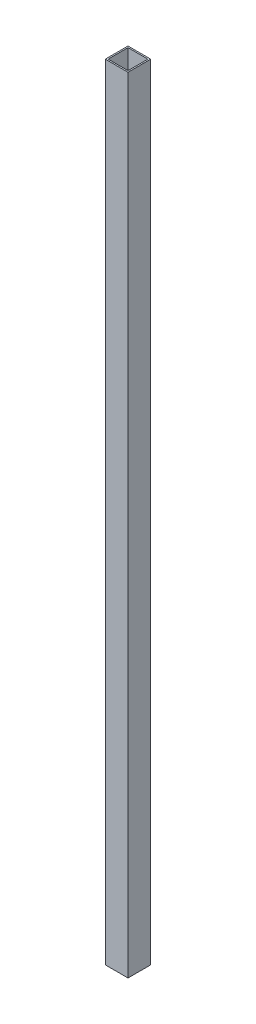
ISO-10303-21;
HEADER;
FILE_DESCRIPTION(('STEP AP214'),'2;1');
FILE_NAME('part.step','',(''),(''),'','','');
FILE_SCHEMA(('AUTOMOTIVE_DESIGN { 1 0 10303 214 1 1 1 1 }'));
ENDSEC;
DATA;
#1=APPLICATION_CONTEXT('core data for automotive mechanical design processes');
#2=APPLICATION_PROTOCOL_DEFINITION('international standard','automotive_design',2000,#1);
#3=PRODUCT_CONTEXT('',#1,'mechanical');
#4=PRODUCT('Part','Part','',(#3));
#5=PRODUCT_RELATED_PRODUCT_CATEGORY('part','',(#4));
#6=PRODUCT_DEFINITION_FORMATION('','',#4);
#7=PRODUCT_DEFINITION_CONTEXT('part definition',#1,'design');
#8=PRODUCT_DEFINITION('design','',#6,#7);
#9=PRODUCT_DEFINITION_SHAPE('','',#8);
#10=(LENGTH_UNIT() NAMED_UNIT(*) SI_UNIT(.MILLI.,.METRE.));
#11=(NAMED_UNIT(*) PLANE_ANGLE_UNIT() SI_UNIT($,.RADIAN.));
#12=(NAMED_UNIT(*) SI_UNIT($,.STERADIAN.) SOLID_ANGLE_UNIT());
#13=UNCERTAINTY_MEASURE_WITH_UNIT(LENGTH_MEASURE(1.E-05),#10,'distance_accuracy_value','');
#14=(GEOMETRIC_REPRESENTATION_CONTEXT(3) GLOBAL_UNCERTAINTY_ASSIGNED_CONTEXT((#13)) GLOBAL_UNIT_ASSIGNED_CONTEXT((#10,
#11,#12)) REPRESENTATION_CONTEXT('',''));
#15=CARTESIAN_POINT('',(0.,0.,0.));
#16=DIRECTION('',(0.,0.,1.));
#17=DIRECTION('',(1.,0.,0.));
#18=AXIS2_PLACEMENT_3D('',#15,#16,#17);
#19=CARTESIAN_POINT('',(0.,876.3,0.));
#20=DIRECTION('',(0.,-1.,0.));
#21=DIRECTION('',(0.,0.,-1.));
#22=AXIS2_PLACEMENT_3D('',#19,#20,#21);
#23=PLANE('',#22);
#24=DIRECTION('',(0.,0.,1.));
#25=VECTOR('',#24,1.);
#26=CARTESIAN_POINT('',(-12.7,876.3,-12.7));
#27=LINE('',#26,#25);
#28=CARTESIAN_POINT('',(-12.7,876.3,-12.7));
#29=VERTEX_POINT('',#28);
#30=CARTESIAN_POINT('',(-12.7,876.3,12.7));
#31=VERTEX_POINT('',#30);
#32=EDGE_CURVE('E133',#29,#31,#27,.T.);
#33=ORIENTED_EDGE('',*,*,#32,.T.);
#34=DIRECTION('',(1.,0.,0.));
#35=VECTOR('',#34,1.);
#36=CARTESIAN_POINT('',(12.7,876.3,12.7));
#37=LINE('',#36,#35);
#38=CARTESIAN_POINT('',(12.7,876.3,12.7));
#39=VERTEX_POINT('',#38);
#40=EDGE_CURVE('E136',#31,#39,#37,.T.);
#41=ORIENTED_EDGE('',*,*,#40,.T.);
#42=DIRECTION('',(0.,0.,-1.));
#43=VECTOR('',#42,1.);
#44=CARTESIAN_POINT('',(12.7,876.3,-12.7));
#45=LINE('',#44,#43);
#46=CARTESIAN_POINT('',(12.7,876.3,-12.7));
#47=VERTEX_POINT('',#46);
#48=EDGE_CURVE('E139',#39,#47,#45,.T.);
#49=ORIENTED_EDGE('',*,*,#48,.T.);
#50=DIRECTION('',(-1.,0.,0.));
#51=VECTOR('',#50,1.);
#52=CARTESIAN_POINT('',(12.7,876.3,-12.7));
#53=LINE('',#52,#51);
#54=EDGE_CURVE('E141',#47,#29,#53,.T.);
#55=ORIENTED_EDGE('',*,*,#54,.T.);
#56=EDGE_LOOP('',(#33,#41,#49,#55));
#57=FACE_BOUND('',#56,.T.);
#58=DIRECTION('',(0.,0.,1.));
#59=VECTOR('',#58,1.);
#60=CARTESIAN_POINT('',(-11.1125,876.3,-11.1125));
#61=LINE('',#60,#59);
#62=CARTESIAN_POINT('',(-11.1125,876.3,-11.1125));
#63=VERTEX_POINT('',#62);
#64=CARTESIAN_POINT('',(-11.1125,876.3,11.1125));
#65=VERTEX_POINT('',#64);
#66=EDGE_CURVE('E97',#63,#65,#61,.T.);
#67=ORIENTED_EDGE('',*,*,#66,.F.);
#68=DIRECTION('',(-1.,0.,0.));
#69=VECTOR('',#68,1.);
#70=CARTESIAN_POINT('',(11.1125,876.3,-11.1125));
#71=LINE('',#70,#69);
#72=CARTESIAN_POINT('',(11.1125,876.3,-11.1125));
#73=VERTEX_POINT('',#72);
#74=EDGE_CURVE('E119',#73,#63,#71,.T.);
#75=ORIENTED_EDGE('',*,*,#74,.F.);
#76=DIRECTION('',(0.,0.,-1.));
#77=VECTOR('',#76,1.);
#78=CARTESIAN_POINT('',(11.1125,876.3,-11.1125));
#79=LINE('',#78,#77);
#80=CARTESIAN_POINT('',(11.1125,876.3,11.1125));
#81=VERTEX_POINT('',#80);
#82=EDGE_CURVE('E117',#81,#73,#79,.T.);
#83=ORIENTED_EDGE('',*,*,#82,.F.);
#84=DIRECTION('',(1.,0.,0.));
#85=VECTOR('',#84,1.);
#86=CARTESIAN_POINT('',(11.1125,876.3,11.1125));
#87=LINE('',#86,#85);
#88=EDGE_CURVE('E105',#65,#81,#87,.T.);
#89=ORIENTED_EDGE('',*,*,#88,.F.);
#90=EDGE_LOOP('',(#67,#75,#83,#89));
#91=FACE_BOUND('',#90,.T.);
#92=ADVANCED_FACE('F32',(#57,#91),#23,.F.);
#93=CARTESIAN_POINT('',(0.,0.,0.));
#94=DIRECTION('',(0.,-1.,0.));
#95=DIRECTION('',(0.,0.,-1.));
#96=AXIS2_PLACEMENT_3D('',#93,#94,#95);
#97=PLANE('',#96);
#98=DIRECTION('',(0.,0.,1.));
#99=VECTOR('',#98,1.);
#100=CARTESIAN_POINT('',(-12.7,0.,-12.7));
#101=LINE('',#100,#99);
#102=CARTESIAN_POINT('',(-12.7,0.,-12.7));
#103=VERTEX_POINT('',#102);
#104=CARTESIAN_POINT('',(-12.7,0.,12.7));
#105=VERTEX_POINT('',#104);
#106=EDGE_CURVE('E113',#103,#105,#101,.T.);
#107=ORIENTED_EDGE('',*,*,#106,.F.);
#108=DIRECTION('',(-1.,0.,0.));
#109=VECTOR('',#108,1.);
#110=CARTESIAN_POINT('',(12.7,0.,-12.7));
#111=LINE('',#110,#109);
#112=CARTESIAN_POINT('',(12.7,0.,-12.7));
#113=VERTEX_POINT('',#112);
#114=EDGE_CURVE('E137',#113,#103,#111,.T.);
#115=ORIENTED_EDGE('',*,*,#114,.F.);
#116=DIRECTION('',(0.,0.,-1.));
#117=VECTOR('',#116,1.);
#118=CARTESIAN_POINT('',(12.7,0.,-12.7));
#119=LINE('',#118,#117);
#120=CARTESIAN_POINT('',(12.7,0.,12.7));
#121=VERTEX_POINT('',#120);
#122=EDGE_CURVE('E148',#121,#113,#119,.T.);
#123=ORIENTED_EDGE('',*,*,#122,.F.);
#124=DIRECTION('',(1.,0.,0.));
#125=VECTOR('',#124,1.);
#126=CARTESIAN_POINT('',(12.7,0.,12.7));
#127=LINE('',#126,#125);
#128=EDGE_CURVE('E146',#105,#121,#127,.T.);
#129=ORIENTED_EDGE('',*,*,#128,.F.);
#130=EDGE_LOOP('',(#107,#115,#123,#129));
#131=FACE_BOUND('',#130,.T.);
#132=DIRECTION('',(-1.,0.,0.));
#133=VECTOR('',#132,1.);
#134=CARTESIAN_POINT('',(11.1125,0.,-11.1125));
#135=LINE('',#134,#133);
#136=CARTESIAN_POINT('',(11.1125,0.,-11.1125));
#137=VERTEX_POINT('',#136);
#138=CARTESIAN_POINT('',(-11.1125,0.,-11.1125));
#139=VERTEX_POINT('',#138);
#140=EDGE_CURVE('E106',#137,#139,#135,.T.);
#141=ORIENTED_EDGE('',*,*,#140,.T.);
#142=DIRECTION('',(0.,0.,1.));
#143=VECTOR('',#142,1.);
#144=CARTESIAN_POINT('',(-11.1125,0.,-11.1125));
#145=LINE('',#144,#143);
#146=CARTESIAN_POINT('',(-11.1125,0.,11.1125));
#147=VERTEX_POINT('',#146);
#148=EDGE_CURVE('E55',#139,#147,#145,.T.);
#149=ORIENTED_EDGE('',*,*,#148,.T.);
#150=DIRECTION('',(1.,0.,0.));
#151=VECTOR('',#150,1.);
#152=CARTESIAN_POINT('',(11.1125,0.,11.1125));
#153=LINE('',#152,#151);
#154=CARTESIAN_POINT('',(11.1125,0.,11.1125));
#155=VERTEX_POINT('',#154);
#156=EDGE_CURVE('E112',#147,#155,#153,.T.);
#157=ORIENTED_EDGE('',*,*,#156,.T.);
#158=DIRECTION('',(0.,0.,-1.));
#159=VECTOR('',#158,1.);
#160=CARTESIAN_POINT('',(11.1125,0.,-11.1125));
#161=LINE('',#160,#159);
#162=EDGE_CURVE('E125',#155,#137,#161,.T.);
#163=ORIENTED_EDGE('',*,*,#162,.T.);
#164=EDGE_LOOP('',(#141,#149,#157,#163));
#165=FACE_BOUND('',#164,.T.);
#166=ADVANCED_FACE('F166',(#131,#165),#97,.T.);
#167=CARTESIAN_POINT('',(-12.7,876.3,-12.7));
#168=DIRECTION('',(1.,0.,0.));
#169=DIRECTION('',(0.,0.,-1.));
#170=AXIS2_PLACEMENT_3D('',#167,#168,#169);
#171=PLANE('',#170);
#172=ORIENTED_EDGE('',*,*,#106,.T.);
#173=DIRECTION('',(0.,-1.,0.));
#174=VECTOR('',#173,1.);
#175=CARTESIAN_POINT('',(-12.7,876.3,12.7));
#176=LINE('',#175,#174);
#177=EDGE_CURVE('E11',#31,#105,#176,.T.);
#178=ORIENTED_EDGE('',*,*,#177,.F.);
#179=ORIENTED_EDGE('',*,*,#32,.F.);
#180=DIRECTION('',(0.,-1.,0.));
#181=VECTOR('',#180,1.);
#182=CARTESIAN_POINT('',(-12.7,876.3,-12.7));
#183=LINE('',#182,#181);
#184=EDGE_CURVE('E143',#29,#103,#183,.T.);
#185=ORIENTED_EDGE('',*,*,#184,.T.);
#186=EDGE_LOOP('',(#172,#178,#179,#185));
#187=FACE_BOUND('',#186,.T.);
#188=ADVANCED_FACE('F34',(#187),#171,.F.);
#189=CARTESIAN_POINT('',(12.7,876.3,12.7));
#190=DIRECTION('',(0.,0.,-1.));
#191=DIRECTION('',(-1.,0.,0.));
#192=AXIS2_PLACEMENT_3D('',#189,#190,#191);
#193=PLANE('',#192);
#194=ORIENTED_EDGE('',*,*,#128,.T.);
#195=DIRECTION('',(0.,-1.,0.));
#196=VECTOR('',#195,1.);
#197=CARTESIAN_POINT('',(12.7,876.3,12.7));
#198=LINE('',#197,#196);
#199=EDGE_CURVE('E40',#39,#121,#198,.T.);
#200=ORIENTED_EDGE('',*,*,#199,.F.);
#201=ORIENTED_EDGE('',*,*,#40,.F.);
#202=ORIENTED_EDGE('',*,*,#177,.T.);
#203=EDGE_LOOP('',(#194,#200,#201,#202));
#204=FACE_BOUND('',#203,.T.);
#205=ADVANCED_FACE('F176',(#204),#193,.F.);
#206=CARTESIAN_POINT('',(12.7,876.3,-12.7));
#207=DIRECTION('',(-1.,0.,0.));
#208=DIRECTION('',(0.,0.,1.));
#209=AXIS2_PLACEMENT_3D('',#206,#207,#208);
#210=PLANE('',#209);
#211=ORIENTED_EDGE('',*,*,#122,.T.);
#212=DIRECTION('',(0.,-1.,0.));
#213=VECTOR('',#212,1.);
#214=CARTESIAN_POINT('',(12.7,876.3,-12.7));
#215=LINE('',#214,#213);
#216=EDGE_CURVE('E153',#47,#113,#215,.T.);
#217=ORIENTED_EDGE('',*,*,#216,.F.);
#218=ORIENTED_EDGE('',*,*,#48,.F.);
#219=ORIENTED_EDGE('',*,*,#199,.T.);
#220=EDGE_LOOP('',(#211,#217,#218,#219));
#221=FACE_BOUND('',#220,.T.);
#222=ADVANCED_FACE('F160',(#221),#210,.F.);
#223=CARTESIAN_POINT('',(12.7,876.3,-12.7));
#224=DIRECTION('',(0.,0.,1.));
#225=DIRECTION('',(1.,0.,0.));
#226=AXIS2_PLACEMENT_3D('',#223,#224,#225);
#227=PLANE('',#226);
#228=ORIENTED_EDGE('',*,*,#114,.T.);
#229=ORIENTED_EDGE('',*,*,#184,.F.);
#230=ORIENTED_EDGE('',*,*,#54,.F.);
#231=ORIENTED_EDGE('',*,*,#216,.T.);
#232=EDGE_LOOP('',(#228,#229,#230,#231));
#233=FACE_BOUND('',#232,.T.);
#234=ADVANCED_FACE('F170',(#233),#227,.F.);
#235=CARTESIAN_POINT('',(-11.1125,876.3,-11.1125));
#236=DIRECTION('',(1.,0.,0.));
#237=DIRECTION('',(0.,0.,-1.));
#238=AXIS2_PLACEMENT_3D('',#235,#236,#237);
#239=PLANE('',#238);
#240=ORIENTED_EDGE('',*,*,#148,.F.);
#241=DIRECTION('',(0.,-1.,0.));
#242=VECTOR('',#241,1.);
#243=CARTESIAN_POINT('',(-11.1125,876.3,-11.1125));
#244=LINE('',#243,#242);
#245=EDGE_CURVE('E101',#63,#139,#244,.T.);
#246=ORIENTED_EDGE('',*,*,#245,.F.);
#247=ORIENTED_EDGE('',*,*,#66,.T.);
#248=DIRECTION('',(0.,-1.,0.));
#249=VECTOR('',#248,1.);
#250=CARTESIAN_POINT('',(-11.1125,876.3,11.1125));
#251=LINE('',#250,#249);
#252=EDGE_CURVE('E100',#65,#147,#251,.T.);
#253=ORIENTED_EDGE('',*,*,#252,.T.);
#254=EDGE_LOOP('',(#240,#246,#247,#253));
#255=FACE_BOUND('',#254,.T.);
#256=ADVANCED_FACE('F99',(#255),#239,.T.);
#257=CARTESIAN_POINT('',(11.1125,876.3,11.1125));
#258=DIRECTION('',(0.,0.,-1.));
#259=DIRECTION('',(-1.,0.,0.));
#260=AXIS2_PLACEMENT_3D('',#257,#258,#259);
#261=PLANE('',#260);
#262=ORIENTED_EDGE('',*,*,#156,.F.);
#263=ORIENTED_EDGE('',*,*,#252,.F.);
#264=ORIENTED_EDGE('',*,*,#88,.T.);
#265=DIRECTION('',(0.,-1.,0.));
#266=VECTOR('',#265,1.);
#267=CARTESIAN_POINT('',(11.1125,876.3,11.1125));
#268=LINE('',#267,#266);
#269=EDGE_CURVE('E114',#81,#155,#268,.T.);
#270=ORIENTED_EDGE('',*,*,#269,.T.);
#271=EDGE_LOOP('',(#262,#263,#264,#270));
#272=FACE_BOUND('',#271,.T.);
#273=ADVANCED_FACE('F109',(#272),#261,.T.);
#274=CARTESIAN_POINT('',(11.1125,876.3,-11.1125));
#275=DIRECTION('',(-1.,0.,0.));
#276=DIRECTION('',(0.,0.,1.));
#277=AXIS2_PLACEMENT_3D('',#274,#275,#276);
#278=PLANE('',#277);
#279=ORIENTED_EDGE('',*,*,#162,.F.);
#280=ORIENTED_EDGE('',*,*,#269,.F.);
#281=ORIENTED_EDGE('',*,*,#82,.T.);
#282=DIRECTION('',(0.,-1.,0.));
#283=VECTOR('',#282,1.);
#284=CARTESIAN_POINT('',(11.1125,876.3,-11.1125));
#285=LINE('',#284,#283);
#286=EDGE_CURVE('E47',#73,#137,#285,.T.);
#287=ORIENTED_EDGE('',*,*,#286,.T.);
#288=EDGE_LOOP('',(#279,#280,#281,#287));
#289=FACE_BOUND('',#288,.T.);
#290=ADVANCED_FACE('F199',(#289),#278,.T.);
#291=CARTESIAN_POINT('',(11.1125,876.3,-11.1125));
#292=DIRECTION('',(0.,0.,1.));
#293=DIRECTION('',(1.,0.,0.));
#294=AXIS2_PLACEMENT_3D('',#291,#292,#293);
#295=PLANE('',#294);
#296=ORIENTED_EDGE('',*,*,#140,.F.);
#297=ORIENTED_EDGE('',*,*,#286,.F.);
#298=ORIENTED_EDGE('',*,*,#74,.T.);
#299=ORIENTED_EDGE('',*,*,#245,.T.);
#300=EDGE_LOOP('',(#296,#297,#298,#299));
#301=FACE_BOUND('',#300,.T.);
#302=ADVANCED_FACE('F203',(#301),#295,.T.);
#303=CLOSED_SHELL('',(#92,#166,#188,#205,#222,#234,#256,#273,#290,#302));
#304=MANIFOLD_SOLID_BREP('B2',#303);
#305=ADVANCED_BREP_SHAPE_REPRESENTATION('',(#18,#304),#14);
#306=SHAPE_DEFINITION_REPRESENTATION(#9,#305);
ENDSEC;
END-ISO-10303-21;
